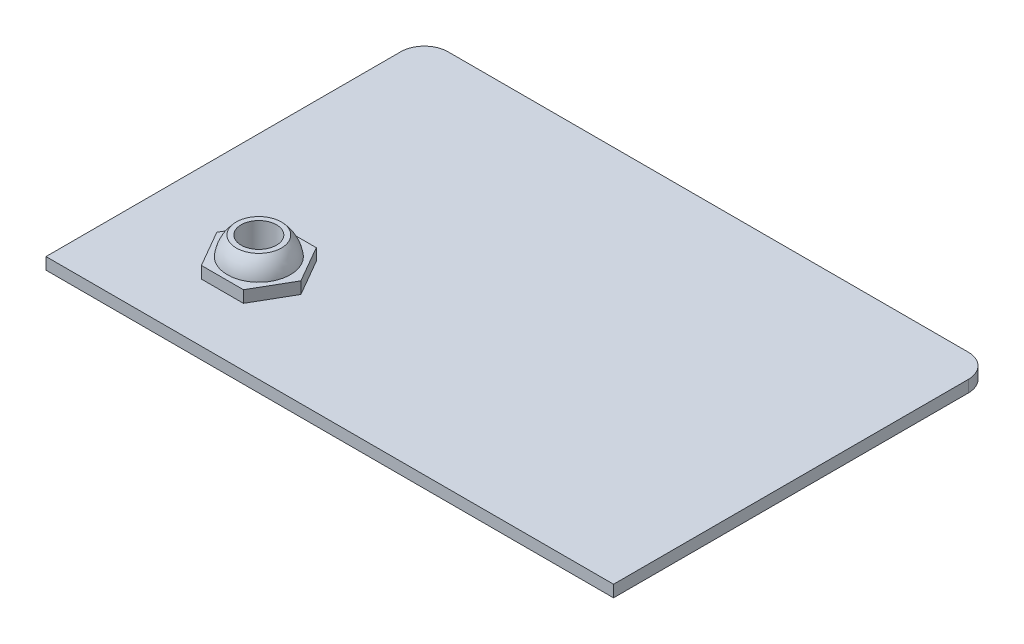
ISO-10303-21;
HEADER;
FILE_DESCRIPTION(('STEP AP214'),'2;1');
FILE_NAME('part.step','',(''),(''),'','','');
FILE_SCHEMA(('AUTOMOTIVE_DESIGN { 1 0 10303 214 1 1 1 1 }'));
ENDSEC;
DATA;
#1=APPLICATION_CONTEXT('core data for automotive mechanical design processes');
#2=APPLICATION_PROTOCOL_DEFINITION('international standard','automotive_design',2000,#1);
#3=PRODUCT_CONTEXT('',#1,'mechanical');
#4=PRODUCT('Part','Part','',(#3));
#5=PRODUCT_RELATED_PRODUCT_CATEGORY('part','',(#4));
#6=PRODUCT_DEFINITION_FORMATION('','',#4);
#7=PRODUCT_DEFINITION_CONTEXT('part definition',#1,'design');
#8=PRODUCT_DEFINITION('design','',#6,#7);
#9=PRODUCT_DEFINITION_SHAPE('','',#8);
#10=(LENGTH_UNIT() NAMED_UNIT(*) SI_UNIT(.MILLI.,.METRE.));
#11=(NAMED_UNIT(*) PLANE_ANGLE_UNIT() SI_UNIT($,.RADIAN.));
#12=(NAMED_UNIT(*) SI_UNIT($,.STERADIAN.) SOLID_ANGLE_UNIT());
#13=UNCERTAINTY_MEASURE_WITH_UNIT(LENGTH_MEASURE(1.E-05),#10,'distance_accuracy_value','');
#14=(GEOMETRIC_REPRESENTATION_CONTEXT(3) GLOBAL_UNCERTAINTY_ASSIGNED_CONTEXT((#13)) GLOBAL_UNIT_ASSIGNED_CONTEXT((#10,
#11,#12)) REPRESENTATION_CONTEXT('',''));
#15=CARTESIAN_POINT('',(0.,0.,0.));
#16=DIRECTION('',(0.,0.,1.));
#17=DIRECTION('',(1.,0.,0.));
#18=AXIS2_PLACEMENT_3D('',#15,#16,#17);
#19=CARTESIAN_POINT('',(6.35,0.,-95.25));
#20=DIRECTION('',(0.,-1.,0.));
#21=DIRECTION('',(0.,0.,-1.));
#22=AXIS2_PLACEMENT_3D('',#19,#20,#21);
#23=PLANE('',#22);
#24=DIRECTION('',(0.,0.,1.));
#25=VECTOR('',#24,1.);
#26=CARTESIAN_POINT('',(0.,0.,0.));
#27=LINE('',#26,#25);
#28=CARTESIAN_POINT('',(0.,0.,-95.2499999999999));
#29=VERTEX_POINT('',#28);
#30=CARTESIAN_POINT('',(0.,0.,0.));
#31=VERTEX_POINT('',#30);
#32=EDGE_CURVE('E141',#29,#31,#27,.T.);
#33=ORIENTED_EDGE('',*,*,#32,.T.);
#34=DIRECTION('',(1.,0.,0.));
#35=VECTOR('',#34,1.);
#36=CARTESIAN_POINT('',(0.,0.,0.));
#37=LINE('',#36,#35);
#38=CARTESIAN_POINT('',(152.4,0.,0.));
#39=VERTEX_POINT('',#38);
#40=EDGE_CURVE('E144',#31,#39,#37,.T.);
#41=ORIENTED_EDGE('',*,*,#40,.T.);
#42=DIRECTION('',(0.,0.,-1.));
#43=VECTOR('',#42,1.);
#44=CARTESIAN_POINT('',(152.4,0.,0.));
#45=LINE('',#44,#43);
#46=CARTESIAN_POINT('',(152.4,0.,-95.2499999999999));
#47=VERTEX_POINT('',#46);
#48=EDGE_CURVE('E172',#39,#47,#45,.T.);
#49=ORIENTED_EDGE('',*,*,#48,.T.);
#50=CARTESIAN_POINT('',(146.05,0.,-95.25));
#51=DIRECTION('',(0.,1.,0.));
#52=DIRECTION('',(0.,0.,-1.));
#53=AXIS2_PLACEMENT_3D('',#50,#51,#52);
#54=CIRCLE('',#53,6.34999999999999);
#55=CARTESIAN_POINT('',(146.05,0.,-101.6));
#56=VERTEX_POINT('',#55);
#57=EDGE_CURVE('E175',#47,#56,#54,.T.);
#58=ORIENTED_EDGE('',*,*,#57,.T.);
#59=DIRECTION('',(-1.,0.,0.));
#60=VECTOR('',#59,1.);
#61=CARTESIAN_POINT('',(6.35000000000004,0.,-101.6));
#62=LINE('',#61,#60);
#63=CARTESIAN_POINT('',(6.35000000000004,0.,-101.6));
#64=VERTEX_POINT('',#63);
#65=EDGE_CURVE('E178',#56,#64,#62,.T.);
#66=ORIENTED_EDGE('',*,*,#65,.T.);
#67=CARTESIAN_POINT('',(6.35,0.,-95.25));
#68=DIRECTION('',(0.,1.,0.));
#69=DIRECTION('',(0.,0.,-1.));
#70=AXIS2_PLACEMENT_3D('',#67,#68,#69);
#71=CIRCLE('',#70,6.35);
#72=EDGE_CURVE('E154',#64,#29,#71,.T.);
#73=ORIENTED_EDGE('',*,*,#72,.T.);
#74=EDGE_LOOP('',(#33,#41,#49,#58,#66,#73));
#75=FACE_BOUND('',#74,.T.);
#76=DIRECTION('',(0.5,0.,-0.866025403784439));
#77=VECTOR('',#76,1.);
#78=CARTESIAN_POINT('',(37.3959082824053,0.,-15.621));
#79=LINE('',#78,#77);
#80=CARTESIAN_POINT('',(37.3959082824053,0.,-15.621));
#81=VERTEX_POINT('',#80);
#82=CARTESIAN_POINT('',(43.0418165648107,0.,-25.4));
#83=VERTEX_POINT('',#82);
#84=EDGE_CURVE('E140',#81,#83,#79,.T.);
#85=ORIENTED_EDGE('',*,*,#84,.F.);
#86=DIRECTION('',(1.,0.,0.));
#87=VECTOR('',#86,1.);
#88=CARTESIAN_POINT('',(26.1040917175946,0.,-15.621));
#89=LINE('',#88,#87);
#90=CARTESIAN_POINT('',(26.1040917175946,0.,-15.621));
#91=VERTEX_POINT('',#90);
#92=EDGE_CURVE('E137',#91,#81,#89,.T.);
#93=ORIENTED_EDGE('',*,*,#92,.F.);
#94=DIRECTION('',(0.5,0.,0.866025403784438));
#95=VECTOR('',#94,1.);
#96=CARTESIAN_POINT('',(20.4581834351893,0.,-25.4));
#97=LINE('',#96,#95);
#98=CARTESIAN_POINT('',(20.4581834351893,0.,-25.4));
#99=VERTEX_POINT('',#98);
#100=EDGE_CURVE('E296',#99,#91,#97,.T.);
#101=ORIENTED_EDGE('',*,*,#100,.F.);
#102=DIRECTION('',(-0.5,0.,0.866025403784439));
#103=VECTOR('',#102,1.);
#104=CARTESIAN_POINT('',(26.1040917175946,0.,-35.179));
#105=LINE('',#104,#103);
#106=CARTESIAN_POINT('',(26.1040917175946,0.,-35.179));
#107=VERTEX_POINT('',#106);
#108=EDGE_CURVE('E293',#107,#99,#105,.T.);
#109=ORIENTED_EDGE('',*,*,#108,.F.);
#110=DIRECTION('',(-1.,0.,0.));
#111=VECTOR('',#110,1.);
#112=CARTESIAN_POINT('',(37.3959082824053,0.,-35.179));
#113=LINE('',#112,#111);
#114=CARTESIAN_POINT('',(37.3959082824053,0.,-35.179));
#115=VERTEX_POINT('',#114);
#116=EDGE_CURVE('E51',#115,#107,#113,.T.);
#117=ORIENTED_EDGE('',*,*,#116,.F.);
#118=DIRECTION('',(-0.5,0.,-0.866025403784439));
#119=VECTOR('',#118,1.);
#120=CARTESIAN_POINT('',(43.0418165648107,0.,-25.4));
#121=LINE('',#120,#119);
#122=EDGE_CURVE('E46',#83,#115,#121,.T.);
#123=ORIENTED_EDGE('',*,*,#122,.F.);
#124=EDGE_LOOP('',(#85,#93,#101,#109,#117,#123));
#125=FACE_BOUND('',#124,.T.);
#126=ADVANCED_FACE('F31',(#75,#125),#23,.F.);
#127=CARTESIAN_POINT('',(0.,-3.175,0.));
#128=DIRECTION('',(-1.,0.,0.));
#129=DIRECTION('',(0.,0.,1.));
#130=AXIS2_PLACEMENT_3D('',#127,#128,#129);
#131=PLANE('',#130);
#132=ORIENTED_EDGE('',*,*,#32,.F.);
#133=DIRECTION('',(0.,1.,0.));
#134=VECTOR('',#133,1.);
#135=CARTESIAN_POINT('',(0.,-3.175,-95.2499999999999));
#136=LINE('',#135,#134);
#137=CARTESIAN_POINT('',(0.,-3.175,-95.2499999999999));
#138=VERTEX_POINT('',#137);
#139=EDGE_CURVE('E39',#138,#29,#136,.T.);
#140=ORIENTED_EDGE('',*,*,#139,.F.);
#141=DIRECTION('',(0.,0.,1.));
#142=VECTOR('',#141,1.);
#143=CARTESIAN_POINT('',(0.,-3.175,0.));
#144=LINE('',#143,#142);
#145=CARTESIAN_POINT('',(0.,-3.175,0.));
#146=VERTEX_POINT('',#145);
#147=EDGE_CURVE('E150',#138,#146,#144,.T.);
#148=ORIENTED_EDGE('',*,*,#147,.T.);
#149=DIRECTION('',(0.,1.,0.));
#150=VECTOR('',#149,1.);
#151=CARTESIAN_POINT('',(0.,-3.175,0.));
#152=LINE('',#151,#150);
#153=EDGE_CURVE('E168',#146,#31,#152,.T.);
#154=ORIENTED_EDGE('',*,*,#153,.T.);
#155=EDGE_LOOP('',(#132,#140,#148,#154));
#156=FACE_BOUND('',#155,.T.);
#157=ADVANCED_FACE('F33',(#156),#131,.T.);
#158=CARTESIAN_POINT('',(6.35,-3.175,-95.25));
#159=DIRECTION('',(0.,1.,0.));
#160=DIRECTION('',(0.,0.,1.));
#161=AXIS2_PLACEMENT_3D('',#158,#159,#160);
#162=CYLINDRICAL_SURFACE('',#161,6.35);
#163=ORIENTED_EDGE('',*,*,#72,.F.);
#164=DIRECTION('',(0.,1.,0.));
#165=VECTOR('',#164,1.);
#166=CARTESIAN_POINT('',(6.35000000000004,-3.175,-101.6));
#167=LINE('',#166,#165);
#168=CARTESIAN_POINT('',(6.35000000000004,-3.175,-101.6));
#169=VERTEX_POINT('',#168);
#170=EDGE_CURVE('E184',#169,#64,#167,.T.);
#171=ORIENTED_EDGE('',*,*,#170,.F.);
#172=CARTESIAN_POINT('',(6.35,-3.175,-95.25));
#173=DIRECTION('',(0.,1.,0.));
#174=DIRECTION('',(0.,0.,-1.));
#175=AXIS2_PLACEMENT_3D('',#172,#173,#174);
#176=CIRCLE('',#175,6.35);
#177=EDGE_CURVE('E166',#169,#138,#176,.T.);
#178=ORIENTED_EDGE('',*,*,#177,.T.);
#179=ORIENTED_EDGE('',*,*,#139,.T.);
#180=EDGE_LOOP('',(#163,#171,#178,#179));
#181=FACE_BOUND('',#180,.T.);
#182=ADVANCED_FACE('F203',(#181),#162,.T.);
#183=CARTESIAN_POINT('',(6.35000000000004,-3.175,-101.6));
#184=DIRECTION('',(0.,0.,-1.));
#185=DIRECTION('',(-1.,0.,0.));
#186=AXIS2_PLACEMENT_3D('',#183,#184,#185);
#187=PLANE('',#186);
#188=ORIENTED_EDGE('',*,*,#65,.F.);
#189=DIRECTION('',(0.,1.,0.));
#190=VECTOR('',#189,1.);
#191=CARTESIAN_POINT('',(146.05,-3.175,-101.6));
#192=LINE('',#191,#190);
#193=CARTESIAN_POINT('',(146.05,-3.175,-101.6));
#194=VERTEX_POINT('',#193);
#195=EDGE_CURVE('E186',#194,#56,#192,.T.);
#196=ORIENTED_EDGE('',*,*,#195,.F.);
#197=DIRECTION('',(-1.,0.,0.));
#198=VECTOR('',#197,1.);
#199=CARTESIAN_POINT('',(6.35000000000004,-3.175,-101.6));
#200=LINE('',#199,#198);
#201=EDGE_CURVE('E163',#194,#169,#200,.T.);
#202=ORIENTED_EDGE('',*,*,#201,.T.);
#203=ORIENTED_EDGE('',*,*,#170,.T.);
#204=EDGE_LOOP('',(#188,#196,#202,#203));
#205=FACE_BOUND('',#204,.T.);
#206=ADVANCED_FACE('F216',(#205),#187,.T.);
#207=CARTESIAN_POINT('',(146.05,-3.175,-95.25));
#208=DIRECTION('',(0.,1.,0.));
#209=DIRECTION('',(0.,0.,1.));
#210=AXIS2_PLACEMENT_3D('',#207,#208,#209);
#211=CYLINDRICAL_SURFACE('',#210,6.34999999999999);
#212=ORIENTED_EDGE('',*,*,#57,.F.);
#213=DIRECTION('',(0.,1.,0.));
#214=VECTOR('',#213,1.);
#215=CARTESIAN_POINT('',(152.4,-3.175,-95.2499999999999));
#216=LINE('',#215,#214);
#217=CARTESIAN_POINT('',(152.4,-3.175,-95.2499999999999));
#218=VERTEX_POINT('',#217);
#219=EDGE_CURVE('E188',#218,#47,#216,.T.);
#220=ORIENTED_EDGE('',*,*,#219,.F.);
#221=CARTESIAN_POINT('',(146.05,-3.175,-95.25));
#222=DIRECTION('',(0.,1.,0.));
#223=DIRECTION('',(0.,0.,-1.));
#224=AXIS2_PLACEMENT_3D('',#221,#222,#223);
#225=CIRCLE('',#224,6.34999999999999);
#226=EDGE_CURVE('E160',#218,#194,#225,.T.);
#227=ORIENTED_EDGE('',*,*,#226,.T.);
#228=ORIENTED_EDGE('',*,*,#195,.T.);
#229=EDGE_LOOP('',(#212,#220,#227,#228));
#230=FACE_BOUND('',#229,.T.);
#231=ADVANCED_FACE('F214',(#230),#211,.T.);
#232=CARTESIAN_POINT('',(152.4,-3.175,0.));
#233=DIRECTION('',(1.,0.,0.));
#234=DIRECTION('',(0.,0.,-1.));
#235=AXIS2_PLACEMENT_3D('',#232,#233,#234);
#236=PLANE('',#235);
#237=ORIENTED_EDGE('',*,*,#48,.F.);
#238=DIRECTION('',(0.,1.,0.));
#239=VECTOR('',#238,1.);
#240=CARTESIAN_POINT('',(152.4,-3.175,0.));
#241=LINE('',#240,#239);
#242=CARTESIAN_POINT('',(152.4,-3.175,0.));
#243=VERTEX_POINT('',#242);
#244=EDGE_CURVE('E190',#243,#39,#241,.T.);
#245=ORIENTED_EDGE('',*,*,#244,.F.);
#246=DIRECTION('',(0.,0.,-1.));
#247=VECTOR('',#246,1.);
#248=CARTESIAN_POINT('',(152.4,-3.175,0.));
#249=LINE('',#248,#247);
#250=EDGE_CURVE('E157',#243,#218,#249,.T.);
#251=ORIENTED_EDGE('',*,*,#250,.T.);
#252=ORIENTED_EDGE('',*,*,#219,.T.);
#253=EDGE_LOOP('',(#237,#245,#251,#252));
#254=FACE_BOUND('',#253,.T.);
#255=ADVANCED_FACE('F211',(#254),#236,.T.);
#256=CARTESIAN_POINT('',(0.,-3.175,0.));
#257=DIRECTION('',(0.,0.,1.));
#258=DIRECTION('',(1.,0.,0.));
#259=AXIS2_PLACEMENT_3D('',#256,#257,#258);
#260=PLANE('',#259);
#261=ORIENTED_EDGE('',*,*,#40,.F.);
#262=ORIENTED_EDGE('',*,*,#153,.F.);
#263=DIRECTION('',(1.,0.,0.));
#264=VECTOR('',#263,1.);
#265=CARTESIAN_POINT('',(0.,-3.175,0.));
#266=LINE('',#265,#264);
#267=EDGE_CURVE('E153',#146,#243,#266,.T.);
#268=ORIENTED_EDGE('',*,*,#267,.T.);
#269=ORIENTED_EDGE('',*,*,#244,.T.);
#270=EDGE_LOOP('',(#261,#262,#268,#269));
#271=FACE_BOUND('',#270,.T.);
#272=ADVANCED_FACE('F197',(#271),#260,.T.);
#273=CARTESIAN_POINT('',(6.35,-3.175,-95.25));
#274=DIRECTION('',(0.,-1.,0.));
#275=DIRECTION('',(0.,0.,-1.));
#276=AXIS2_PLACEMENT_3D('',#273,#274,#275);
#277=PLANE('',#276);
#278=CARTESIAN_POINT('',(31.75,-3.175,-25.4));
#279=DIRECTION('',(0.,1.,0.));
#280=DIRECTION('',(0.,0.,1.));
#281=AXIS2_PLACEMENT_3D('',#278,#279,#280);
#282=CIRCLE('',#281,4.75071940515707);
#283=CARTESIAN_POINT('',(31.75,-3.175,-20.6492805948429));
#284=VERTEX_POINT('',#283);
#285=EDGE_CURVE('E273',#284,#284,#282,.T.);
#286=ORIENTED_EDGE('',*,*,#285,.T.);
#287=EDGE_LOOP('',(#286));
#288=FACE_BOUND('',#287,.T.);
#289=ORIENTED_EDGE('',*,*,#147,.F.);
#290=ORIENTED_EDGE('',*,*,#177,.F.);
#291=ORIENTED_EDGE('',*,*,#201,.F.);
#292=ORIENTED_EDGE('',*,*,#226,.F.);
#293=ORIENTED_EDGE('',*,*,#250,.F.);
#294=ORIENTED_EDGE('',*,*,#267,.F.);
#295=EDGE_LOOP('',(#289,#290,#291,#292,#293,#294));
#296=FACE_BOUND('',#295,.T.);
#297=ADVANCED_FACE('F206',(#288,#296),#277,.T.);
#298=CARTESIAN_POINT('',(37.3959082824053,3.175,-15.621));
#299=DIRECTION('',(-0.866025403784439,0.,-0.5));
#300=DIRECTION('',(-0.5,0.,0.866025403784439));
#301=AXIS2_PLACEMENT_3D('',#298,#299,#300);
#302=PLANE('',#301);
#303=ORIENTED_EDGE('',*,*,#84,.T.);
#304=DIRECTION('',(0.,-1.,0.));
#305=VECTOR('',#304,1.);
#306=CARTESIAN_POINT('',(43.0418165648107,3.175,-25.4));
#307=LINE('',#306,#305);
#308=CARTESIAN_POINT('',(43.0418165648107,3.175,-25.4));
#309=VERTEX_POINT('',#308);
#310=EDGE_CURVE('E121',#309,#83,#307,.T.);
#311=ORIENTED_EDGE('',*,*,#310,.F.);
#312=DIRECTION('',(0.5,0.,-0.866025403784439));
#313=VECTOR('',#312,1.);
#314=CARTESIAN_POINT('',(37.3959082824053,3.175,-15.621));
#315=LINE('',#314,#313);
#316=CARTESIAN_POINT('',(37.3959082824053,3.175,-15.621));
#317=VERTEX_POINT('',#316);
#318=EDGE_CURVE('E128',#317,#309,#315,.T.);
#319=ORIENTED_EDGE('',*,*,#318,.F.);
#320=DIRECTION('',(0.,-1.,0.));
#321=VECTOR('',#320,1.);
#322=CARTESIAN_POINT('',(37.3959082824053,3.175,-15.621));
#323=LINE('',#322,#321);
#324=EDGE_CURVE('E289',#317,#81,#323,.T.);
#325=ORIENTED_EDGE('',*,*,#324,.T.);
#326=EDGE_LOOP('',(#303,#311,#319,#325));
#327=FACE_BOUND('',#326,.T.);
#328=ADVANCED_FACE('F139',(#327),#302,.F.);
#329=CARTESIAN_POINT('',(43.0418165648107,3.175,-25.4));
#330=DIRECTION('',(-0.866025403784439,0.,0.5));
#331=DIRECTION('',(0.5,0.,0.866025403784439));
#332=AXIS2_PLACEMENT_3D('',#329,#330,#331);
#333=PLANE('',#332);
#334=ORIENTED_EDGE('',*,*,#122,.T.);
#335=DIRECTION('',(0.,-1.,0.));
#336=VECTOR('',#335,1.);
#337=CARTESIAN_POINT('',(37.3959082824053,3.175,-35.179));
#338=LINE('',#337,#336);
#339=CARTESIAN_POINT('',(37.3959082824053,3.175,-35.179));
#340=VERTEX_POINT('',#339);
#341=EDGE_CURVE('E124',#340,#115,#338,.T.);
#342=ORIENTED_EDGE('',*,*,#341,.F.);
#343=DIRECTION('',(-0.5,0.,-0.866025403784439));
#344=VECTOR('',#343,1.);
#345=CARTESIAN_POINT('',(43.0418165648107,3.175,-25.4));
#346=LINE('',#345,#344);
#347=EDGE_CURVE('E117',#309,#340,#346,.T.);
#348=ORIENTED_EDGE('',*,*,#347,.F.);
#349=ORIENTED_EDGE('',*,*,#310,.T.);
#350=EDGE_LOOP('',(#334,#342,#348,#349));
#351=FACE_BOUND('',#350,.T.);
#352=ADVANCED_FACE('F119',(#351),#333,.F.);
#353=CARTESIAN_POINT('',(37.3959082824053,3.175,-35.179));
#354=DIRECTION('',(0.,0.,1.));
#355=DIRECTION('',(1.,0.,0.));
#356=AXIS2_PLACEMENT_3D('',#353,#354,#355);
#357=PLANE('',#356);
#358=ORIENTED_EDGE('',*,*,#116,.T.);
#359=DIRECTION('',(0.,-1.,0.));
#360=VECTOR('',#359,1.);
#361=CARTESIAN_POINT('',(26.1040917175946,3.175,-35.179));
#362=LINE('',#361,#360);
#363=CARTESIAN_POINT('',(26.1040917175946,3.175,-35.179));
#364=VERTEX_POINT('',#363);
#365=EDGE_CURVE('E146',#364,#107,#362,.T.);
#366=ORIENTED_EDGE('',*,*,#365,.F.);
#367=DIRECTION('',(-1.,0.,0.));
#368=VECTOR('',#367,1.);
#369=CARTESIAN_POINT('',(37.3959082824053,3.175,-35.179));
#370=LINE('',#369,#368);
#371=EDGE_CURVE('E127',#340,#364,#370,.T.);
#372=ORIENTED_EDGE('',*,*,#371,.F.);
#373=ORIENTED_EDGE('',*,*,#341,.T.);
#374=EDGE_LOOP('',(#358,#366,#372,#373));
#375=FACE_BOUND('',#374,.T.);
#376=ADVANCED_FACE('F238',(#375),#357,.F.);
#377=CARTESIAN_POINT('',(26.1040917175946,3.175,-35.179));
#378=DIRECTION('',(0.866025403784439,0.,0.5));
#379=DIRECTION('',(0.5,0.,-0.866025403784439));
#380=AXIS2_PLACEMENT_3D('',#377,#378,#379);
#381=PLANE('',#380);
#382=ORIENTED_EDGE('',*,*,#108,.T.);
#383=DIRECTION('',(0.,-1.,0.));
#384=VECTOR('',#383,1.);
#385=CARTESIAN_POINT('',(20.4581834351893,3.175,-25.4));
#386=LINE('',#385,#384);
#387=CARTESIAN_POINT('',(20.4581834351893,3.175,-25.4));
#388=VERTEX_POINT('',#387);
#389=EDGE_CURVE('E305',#388,#99,#386,.T.);
#390=ORIENTED_EDGE('',*,*,#389,.F.);
#391=DIRECTION('',(-0.5,0.,0.866025403784439));
#392=VECTOR('',#391,1.);
#393=CARTESIAN_POINT('',(26.1040917175946,3.175,-35.179));
#394=LINE('',#393,#392);
#395=EDGE_CURVE('E284',#364,#388,#394,.T.);
#396=ORIENTED_EDGE('',*,*,#395,.F.);
#397=ORIENTED_EDGE('',*,*,#365,.T.);
#398=EDGE_LOOP('',(#382,#390,#396,#397));
#399=FACE_BOUND('',#398,.T.);
#400=ADVANCED_FACE('F241',(#399),#381,.F.);
#401=CARTESIAN_POINT('',(20.4581834351893,3.175,-25.4));
#402=DIRECTION('',(0.866025403784438,0.,-0.5));
#403=DIRECTION('',(-0.5,0.,-0.866025403784439));
#404=AXIS2_PLACEMENT_3D('',#401,#402,#403);
#405=PLANE('',#404);
#406=ORIENTED_EDGE('',*,*,#100,.T.);
#407=DIRECTION('',(0.,-1.,0.));
#408=VECTOR('',#407,1.);
#409=CARTESIAN_POINT('',(26.1040917175946,3.175,-15.621));
#410=LINE('',#409,#408);
#411=CARTESIAN_POINT('',(26.1040917175946,3.175,-15.621));
#412=VERTEX_POINT('',#411);
#413=EDGE_CURVE('E302',#412,#91,#410,.T.);
#414=ORIENTED_EDGE('',*,*,#413,.F.);
#415=DIRECTION('',(0.5,0.,0.866025403784438));
#416=VECTOR('',#415,1.);
#417=CARTESIAN_POINT('',(20.4581834351893,3.175,-25.4));
#418=LINE('',#417,#416);
#419=EDGE_CURVE('E286',#388,#412,#418,.T.);
#420=ORIENTED_EDGE('',*,*,#419,.F.);
#421=ORIENTED_EDGE('',*,*,#389,.T.);
#422=EDGE_LOOP('',(#406,#414,#420,#421));
#423=FACE_BOUND('',#422,.T.);
#424=ADVANCED_FACE('F245',(#423),#405,.F.);
#425=CARTESIAN_POINT('',(26.1040917175946,3.175,-15.621));
#426=DIRECTION('',(0.,0.,-1.));
#427=DIRECTION('',(-1.,0.,0.));
#428=AXIS2_PLACEMENT_3D('',#425,#426,#427);
#429=PLANE('',#428);
#430=ORIENTED_EDGE('',*,*,#92,.T.);
#431=ORIENTED_EDGE('',*,*,#324,.F.);
#432=DIRECTION('',(1.,0.,0.));
#433=VECTOR('',#432,1.);
#434=CARTESIAN_POINT('',(26.1040917175946,3.175,-15.621));
#435=LINE('',#434,#433);
#436=EDGE_CURVE('E133',#412,#317,#435,.T.);
#437=ORIENTED_EDGE('',*,*,#436,.F.);
#438=ORIENTED_EDGE('',*,*,#413,.T.);
#439=EDGE_LOOP('',(#430,#431,#437,#438));
#440=FACE_BOUND('',#439,.T.);
#441=ADVANCED_FACE('F249',(#440),#429,.F.);
#442=CARTESIAN_POINT('',(43.0418165648107,3.175,-25.4));
#443=DIRECTION('',(0.,1.,0.));
#444=DIRECTION('',(0.,0.,1.));
#445=AXIS2_PLACEMENT_3D('',#442,#443,#444);
#446=PLANE('',#445);
#447=CARTESIAN_POINT('',(31.75,3.175,-25.4));
#448=DIRECTION('',(0.,1.,0.));
#449=DIRECTION('',(0.,0.,1.));
#450=AXIS2_PLACEMENT_3D('',#447,#448,#449);
#451=CIRCLE('',#450,8.46417827618605);
#452=CARTESIAN_POINT('',(31.75,3.175,-16.9358217238139));
#453=VERTEX_POINT('',#452);
#454=EDGE_CURVE('E11',#453,#453,#451,.T.);
#455=ORIENTED_EDGE('',*,*,#454,.F.);
#456=EDGE_LOOP('',(#455));
#457=FACE_BOUND('',#456,.T.);
#458=ORIENTED_EDGE('',*,*,#318,.T.);
#459=ORIENTED_EDGE('',*,*,#347,.T.);
#460=ORIENTED_EDGE('',*,*,#371,.T.);
#461=ORIENTED_EDGE('',*,*,#395,.T.);
#462=ORIENTED_EDGE('',*,*,#419,.T.);
#463=ORIENTED_EDGE('',*,*,#436,.T.);
#464=EDGE_LOOP('',(#458,#459,#460,#461,#462,#463));
#465=FACE_BOUND('',#464,.T.);
#466=ADVANCED_FACE('F131',(#457,#465),#446,.T.);
#467=CARTESIAN_POINT('',(31.75,2.10800607099417,-25.4));
#468=DIRECTION('',(0.,-1.,0.));
#469=DIRECTION('',(0.,0.,-1.));
#470=AXIS2_PLACEMENT_3D('',#467,#468,#469);
#471=DEGENERATE_TOROIDAL_SURFACE('',#470,0.202503013792578,8.73211547258744,.F.);
#472=CARTESIAN_POINT('',(31.75,8.19162981710533,-25.4));
#473=DIRECTION('',(0.,-1.,0.));
#474=DIRECTION('',(0.,0.,-1.));
#475=AXIS2_PLACEMENT_3D('',#472,#473,#474);
#476=CIRCLE('',#475,6.0616300261702);
#477=CARTESIAN_POINT('',(31.75,8.19162981710533,-31.4616300261702));
#478=VERTEX_POINT('',#477);
#479=EDGE_CURVE('E278',#478,#478,#476,.T.);
#480=ORIENTED_EDGE('',*,*,#479,.T.);
#481=EDGE_LOOP('',(#480));
#482=FACE_BOUND('',#481,.T.);
#483=ORIENTED_EDGE('',*,*,#454,.T.);
#484=EDGE_LOOP('',(#483));
#485=FACE_BOUND('',#484,.T.);
#486=ADVANCED_FACE('F256',(#482,#485),#471,.F.);
#487=CARTESIAN_POINT('',(31.75,8.19162981710533,-25.4));
#488=DIRECTION('',(0.,1.,0.));
#489=DIRECTION('',(0.,0.,1.));
#490=AXIS2_PLACEMENT_3D('',#487,#488,#489);
#491=PLANE('',#490);
#492=CARTESIAN_POINT('',(31.75,8.19162981710533,-25.4));
#493=DIRECTION('',(0.,1.,0.));
#494=DIRECTION('',(0.,0.,1.));
#495=AXIS2_PLACEMENT_3D('',#492,#493,#494);
#496=CIRCLE('',#495,4.75071940515707);
#497=CARTESIAN_POINT('',(31.75,8.19162981710533,-20.6492805948429));
#498=VERTEX_POINT('',#497);
#499=EDGE_CURVE('E276',#498,#498,#496,.T.);
#500=ORIENTED_EDGE('',*,*,#499,.F.);
#501=EDGE_LOOP('',(#500));
#502=FACE_BOUND('',#501,.T.);
#503=ORIENTED_EDGE('',*,*,#479,.F.);
#504=EDGE_LOOP('',(#503));
#505=FACE_BOUND('',#504,.T.);
#506=ADVANCED_FACE('F260',(#502,#505),#491,.T.);
#507=CARTESIAN_POINT('',(31.75,-3.175,-25.4));
#508=DIRECTION('',(0.,1.,0.));
#509=DIRECTION('',(0.,0.,1.));
#510=AXIS2_PLACEMENT_3D('',#507,#508,#509);
#511=CYLINDRICAL_SURFACE('',#510,4.75071940515707);
#512=ORIENTED_EDGE('',*,*,#285,.F.);
#513=EDGE_LOOP('',(#512));
#514=FACE_BOUND('',#513,.T.);
#515=ORIENTED_EDGE('',*,*,#499,.T.);
#516=EDGE_LOOP('',(#515));
#517=FACE_BOUND('',#516,.T.);
#518=ADVANCED_FACE('F264',(#514,#517),#511,.F.);
#519=CLOSED_SHELL('',(#126,#157,#182,#206,#231,#255,#272,#297,#328,#352,#376,#400,#424,#441,
#466,#486,#506,#518));
#520=MANIFOLD_SOLID_BREP('B2',#519);
#521=ADVANCED_BREP_SHAPE_REPRESENTATION('',(#18,#520),#14);
#522=SHAPE_DEFINITION_REPRESENTATION(#9,#521);
ENDSEC;
END-ISO-10303-21;
